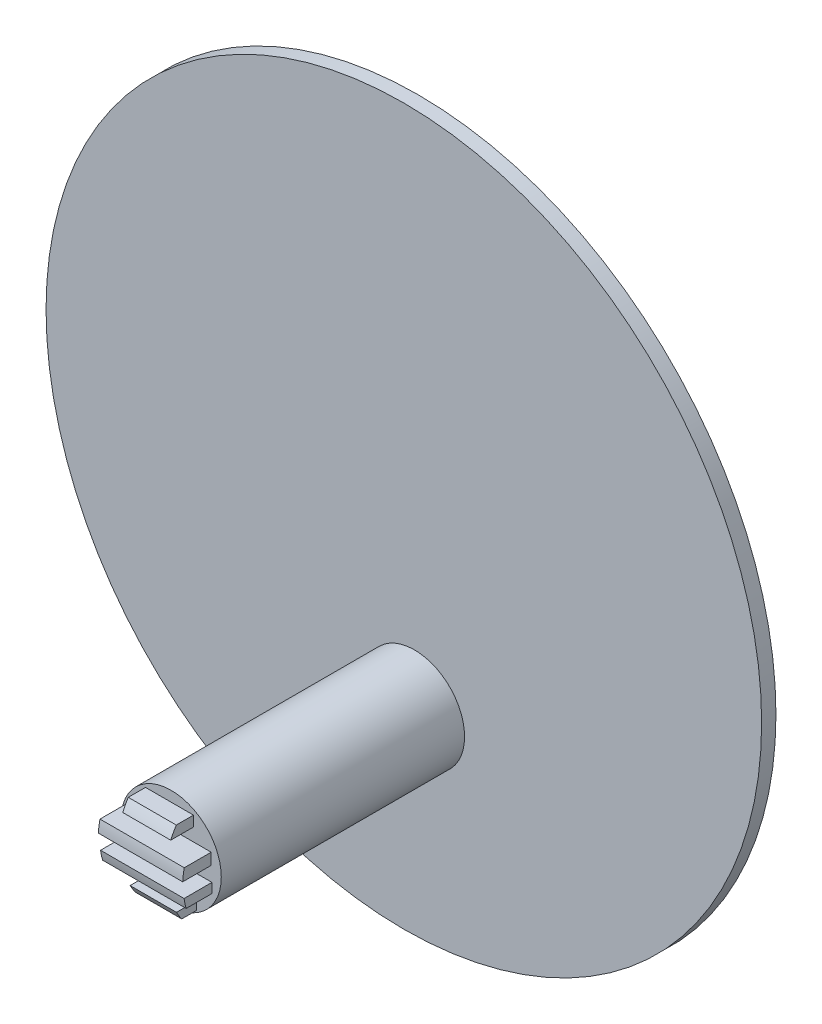
ISO-10303-21;
HEADER;
FILE_DESCRIPTION(('STEP AP214'),'2;1');
FILE_NAME('part.step','',(''),(''),'','','');
FILE_SCHEMA(('AUTOMOTIVE_DESIGN { 1 0 10303 214 1 1 1 1 }'));
ENDSEC;
DATA;
#1=APPLICATION_CONTEXT('core data for automotive mechanical design processes');
#2=APPLICATION_PROTOCOL_DEFINITION('international standard','automotive_design',2000,#1);
#3=PRODUCT_CONTEXT('',#1,'mechanical');
#4=PRODUCT('Part','Part','',(#3));
#5=PRODUCT_RELATED_PRODUCT_CATEGORY('part','',(#4));
#6=PRODUCT_DEFINITION_FORMATION('','',#4);
#7=PRODUCT_DEFINITION_CONTEXT('part definition',#1,'design');
#8=PRODUCT_DEFINITION('design','',#6,#7);
#9=PRODUCT_DEFINITION_SHAPE('','',#8);
#10=(LENGTH_UNIT() NAMED_UNIT(*) SI_UNIT(.MILLI.,.METRE.));
#11=(NAMED_UNIT(*) PLANE_ANGLE_UNIT() SI_UNIT($,.RADIAN.));
#12=(NAMED_UNIT(*) SI_UNIT($,.STERADIAN.) SOLID_ANGLE_UNIT());
#13=UNCERTAINTY_MEASURE_WITH_UNIT(LENGTH_MEASURE(1.E-05),#10,'distance_accuracy_value','');
#14=(GEOMETRIC_REPRESENTATION_CONTEXT(3) GLOBAL_UNCERTAINTY_ASSIGNED_CONTEXT((#13)) GLOBAL_UNIT_ASSIGNED_CONTEXT((#10,
#11,#12)) REPRESENTATION_CONTEXT('',''));
#15=CARTESIAN_POINT('',(0.,0.,0.));
#16=DIRECTION('',(0.,0.,1.));
#17=DIRECTION('',(1.,0.,0.));
#18=AXIS2_PLACEMENT_3D('',#15,#16,#17);
#19=CARTESIAN_POINT('',(-6.47399386491543,-5.63930071174923,8.001));
#20=DIRECTION('',(1.,0.,0.));
#21=DIRECTION('',(0.,0.,-1.));
#22=AXIS2_PLACEMENT_3D('',#19,#20,#21);
#23=PLANE('',#22);
#24=CARTESIAN_POINT('',(-6.47399386491543,-4.45841646048387,6.));
#25=DIRECTION('',(1.,0.,0.));
#26=DIRECTION('',(0.,0.,-1.));
#27=AXIS2_PLACEMENT_3D('',#24,#25,#26);
#28=CIRCLE('',#27,2.);
#29=CARTESIAN_POINT('',(-6.47399386491543,-5.40496326618722,7.76183119072537));
#30=VERTEX_POINT('',#29);
#31=CARTESIAN_POINT('',(-6.47399386491543,-5.63930071174923,7.61415996267825));
#32=VERTEX_POINT('',#31);
#33=EDGE_CURVE('E51',#30,#32,#28,.T.);
#34=ORIENTED_EDGE('',*,*,#33,.F.);
#35=DIRECTION('',(0.,0.,-1.));
#36=VECTOR('',#35,1.);
#37=CARTESIAN_POINT('',(-6.47399386491543,-5.40496326618722,8.001));
#38=LINE('',#37,#36);
#39=CARTESIAN_POINT('',(-6.47399386491543,-5.40496326618722,7.2));
#40=VERTEX_POINT('',#39);
#41=EDGE_CURVE('E98',#30,#40,#38,.T.);
#42=ORIENTED_EDGE('',*,*,#41,.T.);
#43=DIRECTION('',(0.,-1.,0.));
#44=VECTOR('',#43,1.);
#45=CARTESIAN_POINT('',(-6.47399386491543,-5.63930071174923,7.2));
#46=LINE('',#45,#44);
#47=CARTESIAN_POINT('',(-6.47399386491543,-5.63930071174923,7.2));
#48=VERTEX_POINT('',#47);
#49=EDGE_CURVE('E93',#40,#48,#46,.T.);
#50=ORIENTED_EDGE('',*,*,#49,.T.);
#51=DIRECTION('',(0.,0.,-1.));
#52=VECTOR('',#51,1.);
#53=CARTESIAN_POINT('',(-6.47399386491543,-5.63930071174923,8.001));
#54=LINE('',#53,#52);
#55=EDGE_CURVE('E78',#32,#48,#54,.T.);
#56=ORIENTED_EDGE('',*,*,#55,.F.);
#57=EDGE_LOOP('',(#34,#42,#50,#56));
#58=FACE_BOUND('',#57,.T.);
#59=ADVANCED_FACE('F43',(#58),#23,.F.);
#60=CARTESIAN_POINT('',(-6.47399386491543,-5.63930071174923,8.001));
#61=DIRECTION('',(0.,1.,0.));
#62=DIRECTION('',(0.,0.,1.));
#63=AXIS2_PLACEMENT_3D('',#60,#61,#62);
#64=PLANE('',#63);
#65=DIRECTION('',(-1.,0.,0.));
#66=VECTOR('',#65,1.);
#67=CARTESIAN_POINT('',(-4.28717890841213,-5.63930071174923,7.61415996267825));
#68=LINE('',#67,#66);
#69=CARTESIAN_POINT('',(-5.17719290678542,-5.63930071174923,7.61415996267825));
#70=VERTEX_POINT('',#69);
#71=EDGE_CURVE('E57',#32,#70,#68,.F.);
#72=ORIENTED_EDGE('',*,*,#71,.F.);
#73=ORIENTED_EDGE('',*,*,#55,.T.);
#74=DIRECTION('',(1.,0.,0.));
#75=VECTOR('',#74,1.);
#76=CARTESIAN_POINT('',(-6.47399386491543,-5.63930071174923,7.2));
#77=LINE('',#76,#75);
#78=CARTESIAN_POINT('',(-5.17719290678542,-5.63930071174923,7.2));
#79=VERTEX_POINT('',#78);
#80=EDGE_CURVE('E82',#48,#79,#77,.T.);
#81=ORIENTED_EDGE('',*,*,#80,.T.);
#82=DIRECTION('',(0.,0.,-1.));
#83=VECTOR('',#82,1.);
#84=CARTESIAN_POINT('',(-5.17719290678542,-5.63930071174923,8.001));
#85=LINE('',#84,#83);
#86=EDGE_CURVE('E88',#70,#79,#85,.T.);
#87=ORIENTED_EDGE('',*,*,#86,.F.);
#88=EDGE_LOOP('',(#72,#73,#81,#87));
#89=FACE_BOUND('',#88,.T.);
#90=ADVANCED_FACE('F80',(#89),#64,.F.);
#91=CARTESIAN_POINT('',(-5.17719290678542,-5.63930071174923,8.001));
#92=DIRECTION('',(-1.,0.,0.));
#93=DIRECTION('',(0.,0.,1.));
#94=AXIS2_PLACEMENT_3D('',#91,#92,#93);
#95=PLANE('',#94);
#96=CARTESIAN_POINT('',(-5.17719290678542,-4.45841646048387,6.));
#97=DIRECTION('',(-1.,0.,0.));
#98=DIRECTION('',(0.,0.,1.));
#99=AXIS2_PLACEMENT_3D('',#96,#97,#98);
#100=CIRCLE('',#99,2.);
#101=CARTESIAN_POINT('',(-5.17719290678542,-5.40496326618722,7.76183119072537));
#102=VERTEX_POINT('',#101);
#103=EDGE_CURVE('E87',#70,#102,#100,.T.);
#104=ORIENTED_EDGE('',*,*,#103,.F.);
#105=ORIENTED_EDGE('',*,*,#86,.T.);
#106=DIRECTION('',(0.,1.,0.));
#107=VECTOR('',#106,1.);
#108=CARTESIAN_POINT('',(-5.17719290678542,-5.63930071174923,7.2));
#109=LINE('',#108,#107);
#110=CARTESIAN_POINT('',(-5.17719290678542,-5.40496326618722,7.2));
#111=VERTEX_POINT('',#110);
#112=EDGE_CURVE('E95',#79,#111,#109,.T.);
#113=ORIENTED_EDGE('',*,*,#112,.T.);
#114=DIRECTION('',(0.,0.,-1.));
#115=VECTOR('',#114,1.);
#116=CARTESIAN_POINT('',(-5.17719290678542,-5.40496326618722,8.001));
#117=LINE('',#116,#115);
#118=EDGE_CURVE('E108',#102,#111,#117,.T.);
#119=ORIENTED_EDGE('',*,*,#118,.F.);
#120=EDGE_LOOP('',(#104,#105,#113,#119));
#121=FACE_BOUND('',#120,.T.);
#122=ADVANCED_FACE('F111',(#121),#95,.F.);
#123=CARTESIAN_POINT('',(-6.47399386491543,-5.40496326618722,8.001));
#124=DIRECTION('',(0.,-1.,0.));
#125=DIRECTION('',(0.,0.,-1.));
#126=AXIS2_PLACEMENT_3D('',#123,#124,#125);
#127=PLANE('',#126);
#128=DIRECTION('',(-1.,0.,0.));
#129=VECTOR('',#128,1.);
#130=CARTESIAN_POINT('',(-4.28717890841213,-5.40496326618722,7.76183119072537));
#131=LINE('',#130,#129);
#132=EDGE_CURVE('E12',#102,#30,#131,.T.);
#133=ORIENTED_EDGE('',*,*,#132,.F.);
#134=ORIENTED_EDGE('',*,*,#118,.T.);
#135=DIRECTION('',(-1.,0.,0.));
#136=VECTOR('',#135,1.);
#137=CARTESIAN_POINT('',(-6.47399386491543,-5.40496326618722,7.2));
#138=LINE('',#137,#136);
#139=EDGE_CURVE('E105',#111,#40,#138,.T.);
#140=ORIENTED_EDGE('',*,*,#139,.T.);
#141=ORIENTED_EDGE('',*,*,#41,.F.);
#142=EDGE_LOOP('',(#133,#134,#140,#141));
#143=FACE_BOUND('',#142,.T.);
#144=ADVANCED_FACE('F117',(#143),#127,.F.);
#145=CARTESIAN_POINT('',(0.,0.,7.2));
#146=DIRECTION('',(0.,0.,-1.));
#147=DIRECTION('',(-1.,0.,0.));
#148=AXIS2_PLACEMENT_3D('',#145,#146,#147);
#149=PLANE('',#148);
#150=ORIENTED_EDGE('',*,*,#49,.F.);
#151=ORIENTED_EDGE('',*,*,#139,.F.);
#152=ORIENTED_EDGE('',*,*,#112,.F.);
#153=ORIENTED_EDGE('',*,*,#80,.F.);
#154=EDGE_LOOP('',(#150,#151,#152,#153));
#155=FACE_BOUND('',#154,.T.);
#156=ADVANCED_FACE('F91',(#155),#149,.T.);
#157=CARTESIAN_POINT('',(-4.28717890841213,-4.45841646048387,6.));
#158=DIRECTION('',(-1.,0.,0.));
#159=DIRECTION('',(0.,0.,1.));
#160=AXIS2_PLACEMENT_3D('',#157,#158,#159);
#161=CYLINDRICAL_SURFACE('',#160,2.);
#162=ORIENTED_EDGE('',*,*,#33,.T.);
#163=ORIENTED_EDGE('',*,*,#71,.T.);
#164=ORIENTED_EDGE('',*,*,#103,.T.);
#165=ORIENTED_EDGE('',*,*,#132,.T.);
#166=EDGE_LOOP('',(#162,#163,#164,#165));
#167=FACE_BOUND('',#166,.T.);
#168=ADVANCED_FACE('F115',(#167),#161,.T.);
#169=CLOSED_SHELL('',(#59,#90,#122,#144,#156,#168));
#170=MANIFOLD_SOLID_BREP('B2',#169);
#171=CARTESIAN_POINT('',(-5.88693479915037,-4.48808972646475,7.2));
#172=DIRECTION('',(0.,0.,1.));
#173=DIRECTION('',(1.,0.,0.));
#174=AXIS2_PLACEMENT_3D('',#171,#172,#173);
#175=PLANE('',#174);
#176=DIRECTION('',(1.,0.,0.));
#177=VECTOR('',#176,1.);
#178=CARTESIAN_POINT('',(-7.12447589671683,-4.34483042021583,7.2));
#179=LINE('',#178,#177);
#180=CARTESIAN_POINT('',(-7.12447589671683,-4.34483042021583,7.2));
#181=VERTEX_POINT('',#180);
#182=CARTESIAN_POINT('',(-4.76860853797234,-4.34483042021583,7.2));
#183=VERTEX_POINT('',#182);
#184=EDGE_CURVE('E304',#181,#183,#179,.T.);
#185=ORIENTED_EDGE('',*,*,#184,.F.);
#186=DIRECTION('',(0.,-1.,0.));
#187=VECTOR('',#186,1.);
#188=CARTESIAN_POINT('',(-7.12447589671683,-4.34483042021583,7.2));
#189=LINE('',#188,#187);
#190=CARTESIAN_POINT('',(-7.12447589671683,-4.02618887260431,7.2));
#191=VERTEX_POINT('',#190);
#192=EDGE_CURVE('E292',#191,#181,#189,.T.);
#193=ORIENTED_EDGE('',*,*,#192,.F.);
#194=DIRECTION('',(-1.,0.,0.));
#195=VECTOR('',#194,1.);
#196=CARTESIAN_POINT('',(-7.12447589671683,-4.02618887260431,7.2));
#197=LINE('',#196,#195);
#198=CARTESIAN_POINT('',(-4.76860853797234,-4.02618887260431,7.2));
#199=VERTEX_POINT('',#198);
#200=EDGE_CURVE('E308',#199,#191,#197,.T.);
#201=ORIENTED_EDGE('',*,*,#200,.F.);
#202=DIRECTION('',(0.,1.,0.));
#203=VECTOR('',#202,1.);
#204=CARTESIAN_POINT('',(-4.76860853797234,-4.34483042021583,7.2));
#205=LINE('',#204,#203);
#206=EDGE_CURVE('E190',#183,#199,#205,.T.);
#207=ORIENTED_EDGE('',*,*,#206,.F.);
#208=EDGE_LOOP('',(#185,#193,#201,#207));
#209=FACE_BOUND('',#208,.T.);
#210=CARTESIAN_POINT('',(-5.88693479915037,-4.48808972646475,7.2));
#211=DIRECTION('',(0.,0.,1.));
#212=DIRECTION('',(1.,0.,0.));
#213=AXIS2_PLACEMENT_3D('',#210,#211,#212);
#214=CIRCLE('',#213,1.4);
#215=CARTESIAN_POINT('',(-4.48693479915037,-4.48808972646475,7.2));
#216=VERTEX_POINT('',#215);
#217=EDGE_CURVE('E348',#216,#216,#214,.T.);
#218=ORIENTED_EDGE('',*,*,#217,.T.);
#219=EDGE_LOOP('',(#218));
#220=FACE_BOUND('',#219,.T.);
#221=DIRECTION('',(1.,0.,0.));
#222=VECTOR('',#221,1.);
#223=CARTESIAN_POINT('',(-7.0818752006403,-5.01653067831498,7.2));
#224=LINE('',#223,#222);
#225=CARTESIAN_POINT('',(-7.0818752006403,-5.01653067831498,7.2));
#226=VERTEX_POINT('',#225);
#227=CARTESIAN_POINT('',(-4.74740136473883,-5.01653067831498,7.2));
#228=VERTEX_POINT('',#227);
#229=EDGE_CURVE('E330',#226,#228,#224,.T.);
#230=ORIENTED_EDGE('',*,*,#229,.F.);
#231=DIRECTION('',(0.,-1.,0.));
#232=VECTOR('',#231,1.);
#233=CARTESIAN_POINT('',(-7.0818752006403,-5.01653067831498,7.2));
#234=LINE('',#233,#232);
#235=CARTESIAN_POINT('',(-7.0818752006403,-4.74615930139244,7.2));
#236=VERTEX_POINT('',#235);
#237=EDGE_CURVE('E319',#236,#226,#234,.T.);
#238=ORIENTED_EDGE('',*,*,#237,.F.);
#239=DIRECTION('',(-1.,0.,0.));
#240=VECTOR('',#239,1.);
#241=CARTESIAN_POINT('',(-7.0818752006403,-4.74615930139244,7.2));
#242=LINE('',#241,#240);
#243=CARTESIAN_POINT('',(-4.74740136473883,-4.74615930139244,7.2));
#244=VERTEX_POINT('',#243);
#245=EDGE_CURVE('E335',#244,#236,#242,.T.);
#246=ORIENTED_EDGE('',*,*,#245,.F.);
#247=DIRECTION('',(0.,1.,0.));
#248=VECTOR('',#247,1.);
#249=CARTESIAN_POINT('',(-4.74740136473883,-5.01653067831498,7.2));
#250=LINE('',#249,#248);
#251=EDGE_CURVE('E333',#228,#244,#250,.T.);
#252=ORIENTED_EDGE('',*,*,#251,.F.);
#253=EDGE_LOOP('',(#230,#238,#246,#252));
#254=FACE_BOUND('',#253,.T.);
#255=DIRECTION('',(1.,0.,0.));
#256=VECTOR('',#255,1.);
#257=CARTESIAN_POINT('',(-6.60495390189908,-3.66508180899672,7.2));
#258=LINE('',#257,#256);
#259=CARTESIAN_POINT('',(-6.60495390189908,-3.66508180899672,7.2));
#260=VERTEX_POINT('',#259);
#261=CARTESIAN_POINT('',(-5.263629897172,-3.66508180899672,7.2));
#262=VERTEX_POINT('',#261);
#263=EDGE_CURVE('E264',#260,#262,#258,.T.);
#264=ORIENTED_EDGE('',*,*,#263,.F.);
#265=DIRECTION('',(0.,-1.,0.));
#266=VECTOR('',#265,1.);
#267=CARTESIAN_POINT('',(-6.60495390189908,-3.66508180899672,7.2));
#268=LINE('',#267,#266);
#269=CARTESIAN_POINT('',(-6.60495390189908,-3.37585901422699,7.2));
#270=VERTEX_POINT('',#269);
#271=EDGE_CURVE('E272',#270,#260,#268,.T.);
#272=ORIENTED_EDGE('',*,*,#271,.F.);
#273=DIRECTION('',(-1.,0.,0.));
#274=VECTOR('',#273,1.);
#275=CARTESIAN_POINT('',(-6.60495390189908,-3.37585901422699,7.2));
#276=LINE('',#275,#274);
#277=CARTESIAN_POINT('',(-5.263629897172,-3.37585901422699,7.2));
#278=VERTEX_POINT('',#277);
#279=EDGE_CURVE('E281',#278,#270,#276,.T.);
#280=ORIENTED_EDGE('',*,*,#279,.F.);
#281=DIRECTION('',(0.,1.,0.));
#282=VECTOR('',#281,1.);
#283=CARTESIAN_POINT('',(-5.263629897172,-3.66508180899672,7.2));
#284=LINE('',#283,#282);
#285=EDGE_CURVE('E182',#262,#278,#284,.T.);
#286=ORIENTED_EDGE('',*,*,#285,.F.);
#287=EDGE_LOOP('',(#264,#272,#280,#286));
#288=FACE_BOUND('',#287,.T.);
#289=ADVANCED_FACE('F167',(#209,#220,#254,#288),#175,.T.);
#290=CARTESIAN_POINT('',(-6.18437235502239,0.,0.4));
#291=DIRECTION('',(0.,0.,1.));
#292=DIRECTION('',(1.,0.,0.));
#293=AXIS2_PLACEMENT_3D('',#290,#291,#292);
#294=PLANE('',#293);
#295=CARTESIAN_POINT('',(-6.18437235502239,0.,0.4));
#296=DIRECTION('',(0.,0.,1.));
#297=DIRECTION('',(1.,0.,0.));
#298=AXIS2_PLACEMENT_3D('',#295,#296,#297);
#299=CIRCLE('',#298,10.);
#300=CARTESIAN_POINT('',(3.81562764497761,0.,0.4));
#301=VERTEX_POINT('',#300);
#302=EDGE_CURVE('E41',#301,#301,#299,.T.);
#303=ORIENTED_EDGE('',*,*,#302,.T.);
#304=EDGE_LOOP('',(#303));
#305=FACE_BOUND('',#304,.T.);
#306=CARTESIAN_POINT('',(-5.88693479915037,-4.48808972646475,0.4));
#307=DIRECTION('',(0.,0.,1.));
#308=DIRECTION('',(1.,0.,0.));
#309=AXIS2_PLACEMENT_3D('',#306,#307,#308);
#310=CIRCLE('',#309,1.4);
#311=CARTESIAN_POINT('',(-4.48693479915037,-4.48808972646475,0.4));
#312=VERTEX_POINT('',#311);
#313=EDGE_CURVE('E347',#312,#312,#310,.T.);
#314=ORIENTED_EDGE('',*,*,#313,.F.);
#315=EDGE_LOOP('',(#314));
#316=FACE_BOUND('',#315,.T.);
#317=ADVANCED_FACE('F356',(#305,#316),#294,.T.);
#318=CARTESIAN_POINT('',(-6.18437235502239,0.,0.4));
#319=DIRECTION('',(0.,0.,-1.));
#320=DIRECTION('',(-1.,0.,0.));
#321=AXIS2_PLACEMENT_3D('',#318,#319,#320);
#322=CYLINDRICAL_SURFACE('',#321,10.);
#323=ORIENTED_EDGE('',*,*,#302,.F.);
#324=EDGE_LOOP('',(#323));
#325=FACE_BOUND('',#324,.T.);
#326=CARTESIAN_POINT('',(-6.18437235502239,0.,0.));
#327=DIRECTION('',(0.,0.,1.));
#328=DIRECTION('',(1.,0.,0.));
#329=AXIS2_PLACEMENT_3D('',#326,#327,#328);
#330=CIRCLE('',#329,10.);
#331=CARTESIAN_POINT('',(3.81562764497761,0.,0.));
#332=VERTEX_POINT('',#331);
#333=EDGE_CURVE('E171',#332,#332,#330,.T.);
#334=ORIENTED_EDGE('',*,*,#333,.T.);
#335=EDGE_LOOP('',(#334));
#336=FACE_BOUND('',#335,.T.);
#337=ADVANCED_FACE('F169',(#325,#336),#322,.T.);
#338=CARTESIAN_POINT('',(-6.18437235502239,0.,0.));
#339=DIRECTION('',(0.,0.,1.));
#340=DIRECTION('',(1.,0.,0.));
#341=AXIS2_PLACEMENT_3D('',#338,#339,#340);
#342=PLANE('',#341);
#343=ORIENTED_EDGE('',*,*,#333,.F.);
#344=EDGE_LOOP('',(#343));
#345=FACE_BOUND('',#344,.T.);
#346=ADVANCED_FACE('F365',(#345),#342,.F.);
#347=CARTESIAN_POINT('',(-5.88693479915037,-4.48808972646475,7.2));
#348=DIRECTION('',(0.,0.,-1.));
#349=DIRECTION('',(-1.,0.,0.));
#350=AXIS2_PLACEMENT_3D('',#347,#348,#349);
#351=CYLINDRICAL_SURFACE('',#350,1.4);
#352=ORIENTED_EDGE('',*,*,#217,.F.);
#353=EDGE_LOOP('',(#352));
#354=FACE_BOUND('',#353,.T.);
#355=ORIENTED_EDGE('',*,*,#313,.T.);
#356=EDGE_LOOP('',(#355));
#357=FACE_BOUND('',#356,.T.);
#358=ADVANCED_FACE('F354',(#354,#357),#351,.T.);
#359=CARTESIAN_POINT('',(-7.0818752006403,-5.01653067831498,8.001));
#360=DIRECTION('',(1.,0.,0.));
#361=DIRECTION('',(0.,0.,-1.));
#362=AXIS2_PLACEMENT_3D('',#359,#360,#361);
#363=PLANE('',#362);
#364=CARTESIAN_POINT('',(-7.0818752006403,-4.45841646048387,6.));
#365=DIRECTION('',(1.,0.,0.));
#366=DIRECTION('',(0.,0.,-1.));
#367=AXIS2_PLACEMENT_3D('',#364,#365,#366);
#368=CIRCLE('',#367,2.);
#369=CARTESIAN_POINT('',(-7.0818752006403,-4.74615930139244,7.97919277926782));
#370=VERTEX_POINT('',#369);
#371=CARTESIAN_POINT('',(-7.0818752006403,-5.01653067831498,7.92054901521798));
#372=VERTEX_POINT('',#371);
#373=EDGE_CURVE('E325',#370,#372,#368,.T.);
#374=ORIENTED_EDGE('',*,*,#373,.F.);
#375=DIRECTION('',(0.,0.,-1.));
#376=VECTOR('',#375,1.);
#377=CARTESIAN_POINT('',(-7.0818752006403,-4.74615930139244,8.001));
#378=LINE('',#377,#376);
#379=EDGE_CURVE('E338',#370,#236,#378,.T.);
#380=ORIENTED_EDGE('',*,*,#379,.T.);
#381=ORIENTED_EDGE('',*,*,#237,.T.);
#382=DIRECTION('',(0.,0.,-1.));
#383=VECTOR('',#382,1.);
#384=CARTESIAN_POINT('',(-7.0818752006403,-5.01653067831498,8.001));
#385=LINE('',#384,#383);
#386=EDGE_CURVE('E323',#372,#226,#385,.T.);
#387=ORIENTED_EDGE('',*,*,#386,.F.);
#388=EDGE_LOOP('',(#374,#380,#381,#387));
#389=FACE_BOUND('',#388,.T.);
#390=ADVANCED_FACE('F376',(#389),#363,.F.);
#391=CARTESIAN_POINT('',(-7.0818752006403,-5.01653067831498,8.001));
#392=DIRECTION('',(0.,1.,0.));
#393=DIRECTION('',(0.,0.,1.));
#394=AXIS2_PLACEMENT_3D('',#391,#392,#393);
#395=PLANE('',#394);
#396=DIRECTION('',(-1.,0.,0.));
#397=VECTOR('',#396,1.);
#398=CARTESIAN_POINT('',(-4.28717890841213,-5.01653067831498,7.92054901521798));
#399=LINE('',#398,#397);
#400=CARTESIAN_POINT('',(-4.74740136473883,-5.01653067831498,7.92054901521798));
#401=VERTEX_POINT('',#400);
#402=EDGE_CURVE('E322',#372,#401,#399,.F.);
#403=ORIENTED_EDGE('',*,*,#402,.F.);
#404=ORIENTED_EDGE('',*,*,#386,.T.);
#405=ORIENTED_EDGE('',*,*,#229,.T.);
#406=DIRECTION('',(0.,0.,-1.));
#407=VECTOR('',#406,1.);
#408=CARTESIAN_POINT('',(-4.74740136473883,-5.01653067831498,8.001));
#409=LINE('',#408,#407);
#410=EDGE_CURVE('E343',#401,#228,#409,.T.);
#411=ORIENTED_EDGE('',*,*,#410,.F.);
#412=EDGE_LOOP('',(#403,#404,#405,#411));
#413=FACE_BOUND('',#412,.T.);
#414=ADVANCED_FACE('F383',(#413),#395,.F.);
#415=CARTESIAN_POINT('',(-4.74740136473883,-5.01653067831498,8.001));
#416=DIRECTION('',(-1.,0.,0.));
#417=DIRECTION('',(0.,0.,1.));
#418=AXIS2_PLACEMENT_3D('',#415,#416,#417);
#419=PLANE('',#418);
#420=CARTESIAN_POINT('',(-4.74740136473883,-4.45841646048387,6.));
#421=DIRECTION('',(-1.,0.,0.));
#422=DIRECTION('',(0.,0.,1.));
#423=AXIS2_PLACEMENT_3D('',#420,#421,#422);
#424=CIRCLE('',#423,2.);
#425=CARTESIAN_POINT('',(-4.74740136473883,-4.74615930139244,7.97919277926782));
#426=VERTEX_POINT('',#425);
#427=EDGE_CURVE('E320',#401,#426,#424,.T.);
#428=ORIENTED_EDGE('',*,*,#427,.F.);
#429=ORIENTED_EDGE('',*,*,#410,.T.);
#430=ORIENTED_EDGE('',*,*,#251,.T.);
#431=DIRECTION('',(0.,0.,-1.));
#432=VECTOR('',#431,1.);
#433=CARTESIAN_POINT('',(-4.74740136473883,-4.74615930139244,8.001));
#434=LINE('',#433,#432);
#435=EDGE_CURVE('E340',#426,#244,#434,.T.);
#436=ORIENTED_EDGE('',*,*,#435,.F.);
#437=EDGE_LOOP('',(#428,#429,#430,#436));
#438=FACE_BOUND('',#437,.T.);
#439=ADVANCED_FACE('F405',(#438),#419,.F.);
#440=CARTESIAN_POINT('',(-7.0818752006403,-4.74615930139244,8.001));
#441=DIRECTION('',(0.,-1.,0.));
#442=DIRECTION('',(0.,0.,-1.));
#443=AXIS2_PLACEMENT_3D('',#440,#441,#442);
#444=PLANE('',#443);
#445=DIRECTION('',(-1.,0.,0.));
#446=VECTOR('',#445,1.);
#447=CARTESIAN_POINT('',(-4.28717890841213,-4.74615930139244,7.97919277926782));
#448=LINE('',#447,#446);
#449=EDGE_CURVE('E327',#426,#370,#448,.T.);
#450=ORIENTED_EDGE('',*,*,#449,.F.);
#451=ORIENTED_EDGE('',*,*,#435,.T.);
#452=ORIENTED_EDGE('',*,*,#245,.T.);
#453=ORIENTED_EDGE('',*,*,#379,.F.);
#454=EDGE_LOOP('',(#450,#451,#452,#453));
#455=FACE_BOUND('',#454,.T.);
#456=ADVANCED_FACE('F401',(#455),#444,.F.);
#457=CARTESIAN_POINT('',(-4.28717890841213,-4.45841646048387,6.));
#458=DIRECTION('',(-1.,0.,0.));
#459=DIRECTION('',(0.,0.,1.));
#460=AXIS2_PLACEMENT_3D('',#457,#458,#459);
#461=CYLINDRICAL_SURFACE('',#460,2.);
#462=ORIENTED_EDGE('',*,*,#373,.T.);
#463=ORIENTED_EDGE('',*,*,#402,.T.);
#464=ORIENTED_EDGE('',*,*,#427,.T.);
#465=ORIENTED_EDGE('',*,*,#449,.T.);
#466=EDGE_LOOP('',(#462,#463,#464,#465));
#467=FACE_BOUND('',#466,.T.);
#468=ADVANCED_FACE('F407',(#467),#461,.T.);
#469=CARTESIAN_POINT('',(-7.12447589671683,-4.34483042021583,8.001));
#470=DIRECTION('',(1.,0.,0.));
#471=DIRECTION('',(0.,0.,-1.));
#472=AXIS2_PLACEMENT_3D('',#469,#470,#471);
#473=PLANE('',#472);
#474=CARTESIAN_POINT('',(-7.12447589671683,-4.45841646048387,6.));
#475=DIRECTION('',(1.,0.,0.));
#476=DIRECTION('',(0.,0.,-1.));
#477=AXIS2_PLACEMENT_3D('',#474,#475,#476);
#478=CIRCLE('',#477,2.);
#479=CARTESIAN_POINT('',(-7.12447589671683,-4.02618887260431,7.95273636527715));
#480=VERTEX_POINT('',#479);
#481=CARTESIAN_POINT('',(-7.12447589671683,-4.34483042021583,7.99677194778378));
#482=VERTEX_POINT('',#481);
#483=EDGE_CURVE('E299',#480,#482,#478,.T.);
#484=ORIENTED_EDGE('',*,*,#483,.F.);
#485=DIRECTION('',(0.,0.,-1.));
#486=VECTOR('',#485,1.);
#487=CARTESIAN_POINT('',(-7.12447589671683,-4.02618887260431,8.001));
#488=LINE('',#487,#486);
#489=EDGE_CURVE('E311',#480,#191,#488,.T.);
#490=ORIENTED_EDGE('',*,*,#489,.T.);
#491=ORIENTED_EDGE('',*,*,#192,.T.);
#492=DIRECTION('',(0.,0.,-1.));
#493=VECTOR('',#492,1.);
#494=CARTESIAN_POINT('',(-7.12447589671683,-4.34483042021583,8.001));
#495=LINE('',#494,#493);
#496=EDGE_CURVE('E297',#482,#181,#495,.T.);
#497=ORIENTED_EDGE('',*,*,#496,.F.);
#498=EDGE_LOOP('',(#484,#490,#491,#497));
#499=FACE_BOUND('',#498,.T.);
#500=ADVANCED_FACE('F409',(#499),#473,.F.);
#501=CARTESIAN_POINT('',(-7.12447589671683,-4.34483042021583,8.001));
#502=DIRECTION('',(0.,1.,0.));
#503=DIRECTION('',(0.,0.,1.));
#504=AXIS2_PLACEMENT_3D('',#501,#502,#503);
#505=PLANE('',#504);
#506=DIRECTION('',(-1.,0.,0.));
#507=VECTOR('',#506,1.);
#508=CARTESIAN_POINT('',(-4.28717890841213,-4.34483042021583,7.99677194778378));
#509=LINE('',#508,#507);
#510=CARTESIAN_POINT('',(-4.76860853797234,-4.34483042021583,7.99677194778378));
#511=VERTEX_POINT('',#510);
#512=EDGE_CURVE('E296',#482,#511,#509,.F.);
#513=ORIENTED_EDGE('',*,*,#512,.F.);
#514=ORIENTED_EDGE('',*,*,#496,.T.);
#515=ORIENTED_EDGE('',*,*,#184,.T.);
#516=DIRECTION('',(0.,0.,-1.));
#517=VECTOR('',#516,1.);
#518=CARTESIAN_POINT('',(-4.76860853797234,-4.34483042021583,8.001));
#519=LINE('',#518,#517);
#520=EDGE_CURVE('E315',#511,#183,#519,.T.);
#521=ORIENTED_EDGE('',*,*,#520,.F.);
#522=EDGE_LOOP('',(#513,#514,#515,#521));
#523=FACE_BOUND('',#522,.T.);
#524=ADVANCED_FACE('F415',(#523),#505,.F.);
#525=CARTESIAN_POINT('',(-4.76860853797234,-4.34483042021583,8.001));
#526=DIRECTION('',(-1.,0.,0.));
#527=DIRECTION('',(0.,0.,1.));
#528=AXIS2_PLACEMENT_3D('',#525,#526,#527);
#529=PLANE('',#528);
#530=CARTESIAN_POINT('',(-4.76860853797234,-4.45841646048387,6.));
#531=DIRECTION('',(-1.,0.,0.));
#532=DIRECTION('',(0.,0.,1.));
#533=AXIS2_PLACEMENT_3D('',#530,#531,#532);
#534=CIRCLE('',#533,2.);
#535=CARTESIAN_POINT('',(-4.76860853797234,-4.02618887260431,7.95273636527715));
#536=VERTEX_POINT('',#535);
#537=EDGE_CURVE('E294',#511,#536,#534,.T.);
#538=ORIENTED_EDGE('',*,*,#537,.F.);
#539=ORIENTED_EDGE('',*,*,#520,.T.);
#540=ORIENTED_EDGE('',*,*,#206,.T.);
#541=DIRECTION('',(0.,0.,-1.));
#542=VECTOR('',#541,1.);
#543=CARTESIAN_POINT('',(-4.76860853797234,-4.02618887260431,8.001));
#544=LINE('',#543,#542);
#545=EDGE_CURVE('E313',#536,#199,#544,.T.);
#546=ORIENTED_EDGE('',*,*,#545,.F.);
#547=EDGE_LOOP('',(#538,#539,#540,#546));
#548=FACE_BOUND('',#547,.T.);
#549=ADVANCED_FACE('F455',(#548),#529,.F.);
#550=CARTESIAN_POINT('',(-7.12447589671683,-4.02618887260431,8.001));
#551=DIRECTION('',(0.,-1.,0.));
#552=DIRECTION('',(0.,0.,-1.));
#553=AXIS2_PLACEMENT_3D('',#550,#551,#552);
#554=PLANE('',#553);
#555=DIRECTION('',(-1.,0.,0.));
#556=VECTOR('',#555,1.);
#557=CARTESIAN_POINT('',(-4.28717890841213,-4.02618887260431,7.95273636527715));
#558=LINE('',#557,#556);
#559=EDGE_CURVE('E301',#536,#480,#558,.T.);
#560=ORIENTED_EDGE('',*,*,#559,.F.);
#561=ORIENTED_EDGE('',*,*,#545,.T.);
#562=ORIENTED_EDGE('',*,*,#200,.T.);
#563=ORIENTED_EDGE('',*,*,#489,.F.);
#564=EDGE_LOOP('',(#560,#561,#562,#563));
#565=FACE_BOUND('',#564,.T.);
#566=ADVANCED_FACE('F464',(#565),#554,.F.);
#567=CARTESIAN_POINT('',(-4.28717890841213,-4.45841646048387,6.));
#568=DIRECTION('',(-1.,0.,0.));
#569=DIRECTION('',(0.,0.,1.));
#570=AXIS2_PLACEMENT_3D('',#567,#568,#569);
#571=CYLINDRICAL_SURFACE('',#570,2.);
#572=ORIENTED_EDGE('',*,*,#483,.T.);
#573=ORIENTED_EDGE('',*,*,#512,.T.);
#574=ORIENTED_EDGE('',*,*,#537,.T.);
#575=ORIENTED_EDGE('',*,*,#559,.T.);
#576=EDGE_LOOP('',(#572,#573,#574,#575));
#577=FACE_BOUND('',#576,.T.);
#578=ADVANCED_FACE('F473',(#577),#571,.T.);
#579=CARTESIAN_POINT('',(-6.60495390189908,-3.66508180899672,8.001));
#580=DIRECTION('',(1.,0.,0.));
#581=DIRECTION('',(0.,0.,-1.));
#582=AXIS2_PLACEMENT_3D('',#579,#580,#581);
#583=PLANE('',#582);
#584=CARTESIAN_POINT('',(-6.60495390189908,-4.45841646048387,6.));
#585=DIRECTION('',(1.,0.,0.));
#586=DIRECTION('',(0.,0.,-1.));
#587=AXIS2_PLACEMENT_3D('',#584,#585,#586);
#588=CIRCLE('',#587,2.);
#589=CARTESIAN_POINT('',(-6.60495390189908,-3.37585901422699,7.68168646767279));
#590=VERTEX_POINT('',#589);
#591=CARTESIAN_POINT('',(-6.60495390189908,-3.66508180899672,7.83592487067139));
#592=VERTEX_POINT('',#591);
#593=EDGE_CURVE('E293',#590,#592,#588,.T.);
#594=ORIENTED_EDGE('',*,*,#593,.F.);
#595=DIRECTION('',(0.,0.,-1.));
#596=VECTOR('',#595,1.);
#597=CARTESIAN_POINT('',(-6.60495390189908,-3.37585901422699,8.001));
#598=LINE('',#597,#596);
#599=EDGE_CURVE('E275',#590,#270,#598,.T.);
#600=ORIENTED_EDGE('',*,*,#599,.T.);
#601=ORIENTED_EDGE('',*,*,#271,.T.);
#602=DIRECTION('',(0.,0.,-1.));
#603=VECTOR('',#602,1.);
#604=CARTESIAN_POINT('',(-6.60495390189908,-3.66508180899672,8.001));
#605=LINE('',#604,#603);
#606=EDGE_CURVE('E259',#592,#260,#605,.T.);
#607=ORIENTED_EDGE('',*,*,#606,.F.);
#608=EDGE_LOOP('',(#594,#600,#601,#607));
#609=FACE_BOUND('',#608,.T.);
#610=ADVANCED_FACE('F273',(#609),#583,.F.);
#611=CARTESIAN_POINT('',(-6.60495390189908,-3.66508180899672,8.001));
#612=DIRECTION('',(0.,1.,0.));
#613=DIRECTION('',(0.,0.,1.));
#614=AXIS2_PLACEMENT_3D('',#611,#612,#613);
#615=PLANE('',#614);
#616=DIRECTION('',(-1.,0.,0.));
#617=VECTOR('',#616,1.);
#618=CARTESIAN_POINT('',(-4.28717890841213,-3.66508180899672,7.83592487067139));
#619=LINE('',#618,#617);
#620=CARTESIAN_POINT('',(-5.263629897172,-3.66508180899672,7.83592487067139));
#621=VERTEX_POINT('',#620);
#622=EDGE_CURVE('E265',#592,#621,#619,.F.);
#623=ORIENTED_EDGE('',*,*,#622,.F.);
#624=ORIENTED_EDGE('',*,*,#606,.T.);
#625=ORIENTED_EDGE('',*,*,#263,.T.);
#626=DIRECTION('',(0.,0.,-1.));
#627=VECTOR('',#626,1.);
#628=CARTESIAN_POINT('',(-5.263629897172,-3.66508180899672,8.001));
#629=LINE('',#628,#627);
#630=EDGE_CURVE('E269',#621,#262,#629,.T.);
#631=ORIENTED_EDGE('',*,*,#630,.F.);
#632=EDGE_LOOP('',(#623,#624,#625,#631));
#633=FACE_BOUND('',#632,.T.);
#634=ADVANCED_FACE('F261',(#633),#615,.F.);
#635=CARTESIAN_POINT('',(-5.263629897172,-3.66508180899672,8.001));
#636=DIRECTION('',(-1.,0.,0.));
#637=DIRECTION('',(0.,0.,1.));
#638=AXIS2_PLACEMENT_3D('',#635,#636,#637);
#639=PLANE('',#638);
#640=CARTESIAN_POINT('',(-5.263629897172,-4.45841646048387,6.));
#641=DIRECTION('',(-1.,0.,0.));
#642=DIRECTION('',(0.,0.,1.));
#643=AXIS2_PLACEMENT_3D('',#640,#641,#642);
#644=CIRCLE('',#643,2.);
#645=CARTESIAN_POINT('',(-5.263629897172,-3.37585901422699,7.68168646767279));
#646=VERTEX_POINT('',#645);
#647=EDGE_CURVE('E268',#621,#646,#644,.T.);
#648=ORIENTED_EDGE('',*,*,#647,.F.);
#649=ORIENTED_EDGE('',*,*,#630,.T.);
#650=ORIENTED_EDGE('',*,*,#285,.T.);
#651=DIRECTION('',(0.,0.,-1.));
#652=VECTOR('',#651,1.);
#653=CARTESIAN_POINT('',(-5.263629897172,-3.37585901422699,8.001));
#654=LINE('',#653,#652);
#655=EDGE_CURVE('E287',#646,#278,#654,.T.);
#656=ORIENTED_EDGE('',*,*,#655,.F.);
#657=EDGE_LOOP('',(#648,#649,#650,#656));
#658=FACE_BOUND('',#657,.T.);
#659=ADVANCED_FACE('F506',(#658),#639,.F.);
#660=CARTESIAN_POINT('',(-6.60495390189908,-3.37585901422699,8.001));
#661=DIRECTION('',(0.,-1.,0.));
#662=DIRECTION('',(0.,0.,-1.));
#663=AXIS2_PLACEMENT_3D('',#660,#661,#662);
#664=PLANE('',#663);
#665=DIRECTION('',(-1.,0.,0.));
#666=VECTOR('',#665,1.);
#667=CARTESIAN_POINT('',(-4.28717890841213,-3.37585901422699,7.68168646767279));
#668=LINE('',#667,#666);
#669=EDGE_CURVE('E290',#646,#590,#668,.T.);
#670=ORIENTED_EDGE('',*,*,#669,.F.);
#671=ORIENTED_EDGE('',*,*,#655,.T.);
#672=ORIENTED_EDGE('',*,*,#279,.T.);
#673=ORIENTED_EDGE('',*,*,#599,.F.);
#674=EDGE_LOOP('',(#670,#671,#672,#673));
#675=FACE_BOUND('',#674,.T.);
#676=ADVANCED_FACE('F515',(#675),#664,.F.);
#677=CARTESIAN_POINT('',(-4.28717890841213,-4.45841646048387,6.));
#678=DIRECTION('',(-1.,0.,0.));
#679=DIRECTION('',(0.,0.,1.));
#680=AXIS2_PLACEMENT_3D('',#677,#678,#679);
#681=CYLINDRICAL_SURFACE('',#680,2.);
#682=ORIENTED_EDGE('',*,*,#593,.T.);
#683=ORIENTED_EDGE('',*,*,#622,.T.);
#684=ORIENTED_EDGE('',*,*,#647,.T.);
#685=ORIENTED_EDGE('',*,*,#669,.T.);
#686=EDGE_LOOP('',(#682,#683,#684,#685));
#687=FACE_BOUND('',#686,.T.);
#688=ADVANCED_FACE('F524',(#687),#681,.T.);
#689=CLOSED_SHELL('',(#289,#317,#337,#346,#358,#390,#414,#439,#456,#468,#500,#524,#549,#566,
#578,#610,#634,#659,#676,#688));
#690=MANIFOLD_SOLID_BREP('B6',#689);
#691=ADVANCED_BREP_SHAPE_REPRESENTATION('',(#18,#170,#690),#14);
#692=SHAPE_DEFINITION_REPRESENTATION(#9,#691);
ENDSEC;
END-ISO-10303-21;
